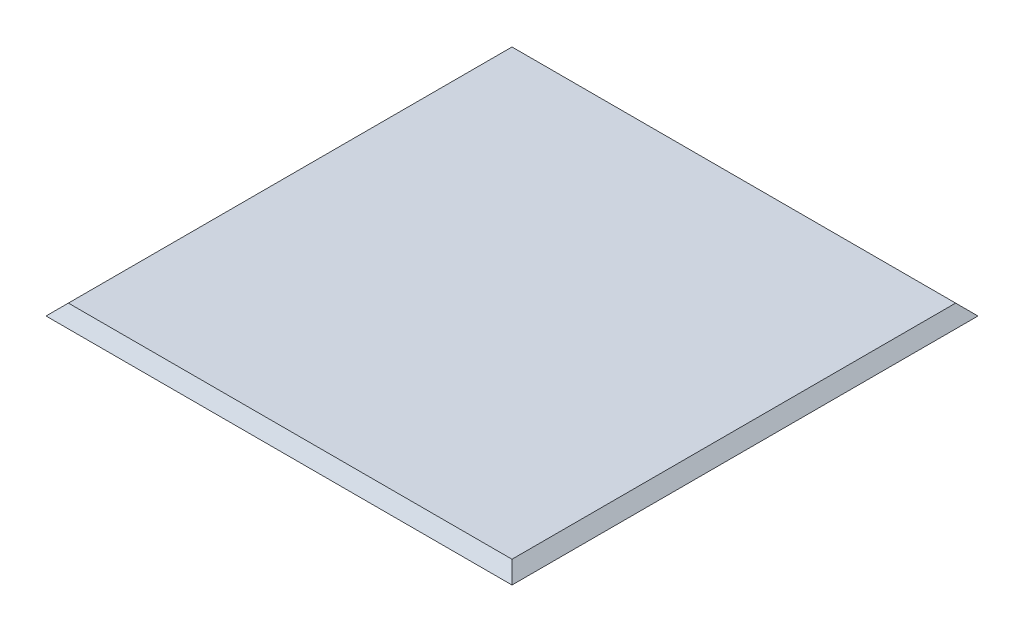
ISO-10303-21;
HEADER;
FILE_DESCRIPTION(('STEP AP214'),'2;1');
FILE_NAME('part.step','',(''),(''),'','','');
FILE_SCHEMA(('AUTOMOTIVE_DESIGN { 1 0 10303 214 1 1 1 1 }'));
ENDSEC;
DATA;
#1=APPLICATION_CONTEXT('core data for automotive mechanical design processes');
#2=APPLICATION_PROTOCOL_DEFINITION('international standard','automotive_design',2000,#1);
#3=PRODUCT_CONTEXT('',#1,'mechanical');
#4=PRODUCT('Part','Part','',(#3));
#5=PRODUCT_RELATED_PRODUCT_CATEGORY('part','',(#4));
#6=PRODUCT_DEFINITION_FORMATION('','',#4);
#7=PRODUCT_DEFINITION_CONTEXT('part definition',#1,'design');
#8=PRODUCT_DEFINITION('design','',#6,#7);
#9=PRODUCT_DEFINITION_SHAPE('','',#8);
#10=(LENGTH_UNIT() NAMED_UNIT(*) SI_UNIT(.MILLI.,.METRE.));
#11=(NAMED_UNIT(*) PLANE_ANGLE_UNIT() SI_UNIT($,.RADIAN.));
#12=(NAMED_UNIT(*) SI_UNIT($,.STERADIAN.) SOLID_ANGLE_UNIT());
#13=UNCERTAINTY_MEASURE_WITH_UNIT(LENGTH_MEASURE(1.E-05),#10,'distance_accuracy_value','');
#14=(GEOMETRIC_REPRESENTATION_CONTEXT(3) GLOBAL_UNCERTAINTY_ASSIGNED_CONTEXT((#13)) GLOBAL_UNIT_ASSIGNED_CONTEXT((#10,
#11,#12)) REPRESENTATION_CONTEXT('',''));
#15=CARTESIAN_POINT('',(0.,0.,0.));
#16=DIRECTION('',(0.,0.,1.));
#17=DIRECTION('',(1.,0.,0.));
#18=AXIS2_PLACEMENT_3D('',#15,#16,#17);
#19=CARTESIAN_POINT('',(0.,12.,0.));
#20=DIRECTION('',(0.,-1.,0.));
#21=DIRECTION('',(0.,0.,-1.));
#22=AXIS2_PLACEMENT_3D('',#19,#20,#21);
#23=PLANE('',#22);
#24=DIRECTION('',(1.,0.,0.));
#25=VECTOR('',#24,1.);
#26=CARTESIAN_POINT('',(0.,12.,-12.));
#27=LINE('',#26,#25);
#28=CARTESIAN_POINT('',(12.,12.,-12.));
#29=VERTEX_POINT('',#28);
#30=CARTESIAN_POINT('',(488.,12.,-12.));
#31=VERTEX_POINT('',#30);
#32=EDGE_CURVE('E106',#29,#31,#27,.T.);
#33=ORIENTED_EDGE('',*,*,#32,.T.);
#34=DIRECTION('',(0.,0.,-1.));
#35=VECTOR('',#34,1.);
#36=CARTESIAN_POINT('',(488.,12.,0.));
#37=LINE('',#36,#35);
#38=CARTESIAN_POINT('',(488.,12.,-488.));
#39=VERTEX_POINT('',#38);
#40=EDGE_CURVE('E11',#31,#39,#37,.T.);
#41=ORIENTED_EDGE('',*,*,#40,.T.);
#42=DIRECTION('',(-1.,0.,0.));
#43=VECTOR('',#42,1.);
#44=CARTESIAN_POINT('',(0.,12.,-488.));
#45=LINE('',#44,#43);
#46=CARTESIAN_POINT('',(12.,12.,-488.));
#47=VERTEX_POINT('',#46);
#48=EDGE_CURVE('E52',#39,#47,#45,.T.);
#49=ORIENTED_EDGE('',*,*,#48,.T.);
#50=DIRECTION('',(0.,0.,1.));
#51=VECTOR('',#50,1.);
#52=CARTESIAN_POINT('',(12.,12.,0.));
#53=LINE('',#52,#51);
#54=EDGE_CURVE('E118',#47,#29,#53,.T.);
#55=ORIENTED_EDGE('',*,*,#54,.T.);
#56=EDGE_LOOP('',(#33,#41,#49,#55));
#57=FACE_BOUND('',#56,.T.);
#58=ADVANCED_FACE('F41',(#57),#23,.F.);
#59=CARTESIAN_POINT('',(0.,0.,0.));
#60=DIRECTION('',(0.,-1.,0.));
#61=DIRECTION('',(0.,0.,-1.));
#62=AXIS2_PLACEMENT_3D('',#59,#60,#61);
#63=PLANE('',#62);
#64=DIRECTION('',(0.,0.,1.));
#65=VECTOR('',#64,1.);
#66=CARTESIAN_POINT('',(0.,0.,0.));
#67=LINE('',#66,#65);
#68=CARTESIAN_POINT('',(0.,0.,-500.));
#69=VERTEX_POINT('',#68);
#70=CARTESIAN_POINT('',(0.,0.,0.));
#71=VERTEX_POINT('',#70);
#72=EDGE_CURVE('E89',#69,#71,#67,.T.);
#73=ORIENTED_EDGE('',*,*,#72,.F.);
#74=DIRECTION('',(-1.,0.,0.));
#75=VECTOR('',#74,1.);
#76=CARTESIAN_POINT('',(0.,0.,-500.));
#77=LINE('',#76,#75);
#78=CARTESIAN_POINT('',(500.,0.,-500.));
#79=VERTEX_POINT('',#78);
#80=EDGE_CURVE('E123',#79,#69,#77,.T.);
#81=ORIENTED_EDGE('',*,*,#80,.F.);
#82=DIRECTION('',(0.,0.,-1.));
#83=VECTOR('',#82,1.);
#84=CARTESIAN_POINT('',(500.,0.,0.));
#85=LINE('',#84,#83);
#86=CARTESIAN_POINT('',(500.,0.,0.));
#87=VERTEX_POINT('',#86);
#88=EDGE_CURVE('E91',#87,#79,#85,.T.);
#89=ORIENTED_EDGE('',*,*,#88,.F.);
#90=DIRECTION('',(1.,0.,0.));
#91=VECTOR('',#90,1.);
#92=CARTESIAN_POINT('',(0.,0.,0.));
#93=LINE('',#92,#91);
#94=EDGE_CURVE('E86',#71,#87,#93,.T.);
#95=ORIENTED_EDGE('',*,*,#94,.F.);
#96=EDGE_LOOP('',(#73,#81,#89,#95));
#97=FACE_BOUND('',#96,.T.);
#98=ADVANCED_FACE('F88',(#97),#63,.T.);
#99=CARTESIAN_POINT('',(12.,12.,0.));
#100=DIRECTION('',(0.707106781186547,-0.707106781186547,0.));
#101=DIRECTION('',(0.,0.,1.));
#102=AXIS2_PLACEMENT_3D('',#99,#100,#101);
#103=PLANE('',#102);
#104=DIRECTION('',(-0.577350269189626,-0.577350269189626,-0.577350269189626));
#105=VECTOR('',#104,1.);
#106=CARTESIAN_POINT('',(174.666666666667,174.666666666667,-325.333333333333));
#107=LINE('',#106,#105);
#108=EDGE_CURVE('E101',#69,#47,#107,.F.);
#109=ORIENTED_EDGE('',*,*,#108,.F.);
#110=ORIENTED_EDGE('',*,*,#72,.T.);
#111=DIRECTION('',(-0.577350269189626,-0.577350269189626,0.577350269189626));
#112=VECTOR('',#111,1.);
#113=CARTESIAN_POINT('',(8.00000000000001,8.,-8.00000000000001));
#114=LINE('',#113,#112);
#115=EDGE_CURVE('E46',#29,#71,#114,.T.);
#116=ORIENTED_EDGE('',*,*,#115,.F.);
#117=ORIENTED_EDGE('',*,*,#54,.F.);
#118=EDGE_LOOP('',(#109,#110,#116,#117));
#119=FACE_BOUND('',#118,.T.);
#120=ADVANCED_FACE('F44',(#119),#103,.F.);
#121=CARTESIAN_POINT('',(0.,12.,-12.));
#122=DIRECTION('',(0.,-0.707106781186547,-0.707106781186547));
#123=DIRECTION('',(1.,0.,0.));
#124=AXIS2_PLACEMENT_3D('',#121,#122,#123);
#125=PLANE('',#124);
#126=ORIENTED_EDGE('',*,*,#115,.T.);
#127=ORIENTED_EDGE('',*,*,#94,.T.);
#128=DIRECTION('',(-0.577350269189626,0.577350269189626,-0.577350269189626));
#129=VECTOR('',#128,1.);
#130=CARTESIAN_POINT('',(325.333333333333,174.666666666667,-174.666666666667));
#131=LINE('',#130,#129);
#132=EDGE_CURVE('E109',#31,#87,#131,.F.);
#133=ORIENTED_EDGE('',*,*,#132,.F.);
#134=ORIENTED_EDGE('',*,*,#32,.F.);
#135=EDGE_LOOP('',(#126,#127,#133,#134));
#136=FACE_BOUND('',#135,.T.);
#137=ADVANCED_FACE('F105',(#136),#125,.F.);
#138=CARTESIAN_POINT('',(0.,12.,-488.));
#139=DIRECTION('',(0.,-0.707106781186547,0.707106781186547));
#140=DIRECTION('',(-1.,0.,0.));
#141=AXIS2_PLACEMENT_3D('',#138,#139,#140);
#142=PLANE('',#141);
#143=ORIENTED_EDGE('',*,*,#108,.T.);
#144=ORIENTED_EDGE('',*,*,#48,.F.);
#145=DIRECTION('',(0.577350269189626,-0.577350269189626,-0.577350269189626));
#146=VECTOR('',#145,1.);
#147=CARTESIAN_POINT('',(325.333333333333,174.666666666667,-325.333333333333));
#148=LINE('',#147,#146);
#149=EDGE_CURVE('E60',#79,#39,#148,.F.);
#150=ORIENTED_EDGE('',*,*,#149,.F.);
#151=ORIENTED_EDGE('',*,*,#80,.T.);
#152=EDGE_LOOP('',(#143,#144,#150,#151));
#153=FACE_BOUND('',#152,.T.);
#154=ADVANCED_FACE('F128',(#153),#142,.F.);
#155=CARTESIAN_POINT('',(488.,12.,0.));
#156=DIRECTION('',(-0.707106781186547,-0.707106781186547,0.));
#157=DIRECTION('',(0.,0.,-1.));
#158=AXIS2_PLACEMENT_3D('',#155,#156,#157);
#159=PLANE('',#158);
#160=ORIENTED_EDGE('',*,*,#132,.T.);
#161=ORIENTED_EDGE('',*,*,#88,.T.);
#162=ORIENTED_EDGE('',*,*,#149,.T.);
#163=ORIENTED_EDGE('',*,*,#40,.F.);
#164=EDGE_LOOP('',(#160,#161,#162,#163));
#165=FACE_BOUND('',#164,.T.);
#166=ADVANCED_FACE('F127',(#165),#159,.F.);
#167=CLOSED_SHELL('',(#58,#98,#120,#137,#154,#166));
#168=MANIFOLD_SOLID_BREP('B2',#167);
#169=ADVANCED_BREP_SHAPE_REPRESENTATION('',(#18,#168),#14);
#170=SHAPE_DEFINITION_REPRESENTATION(#9,#169);
ENDSEC;
END-ISO-10303-21;
